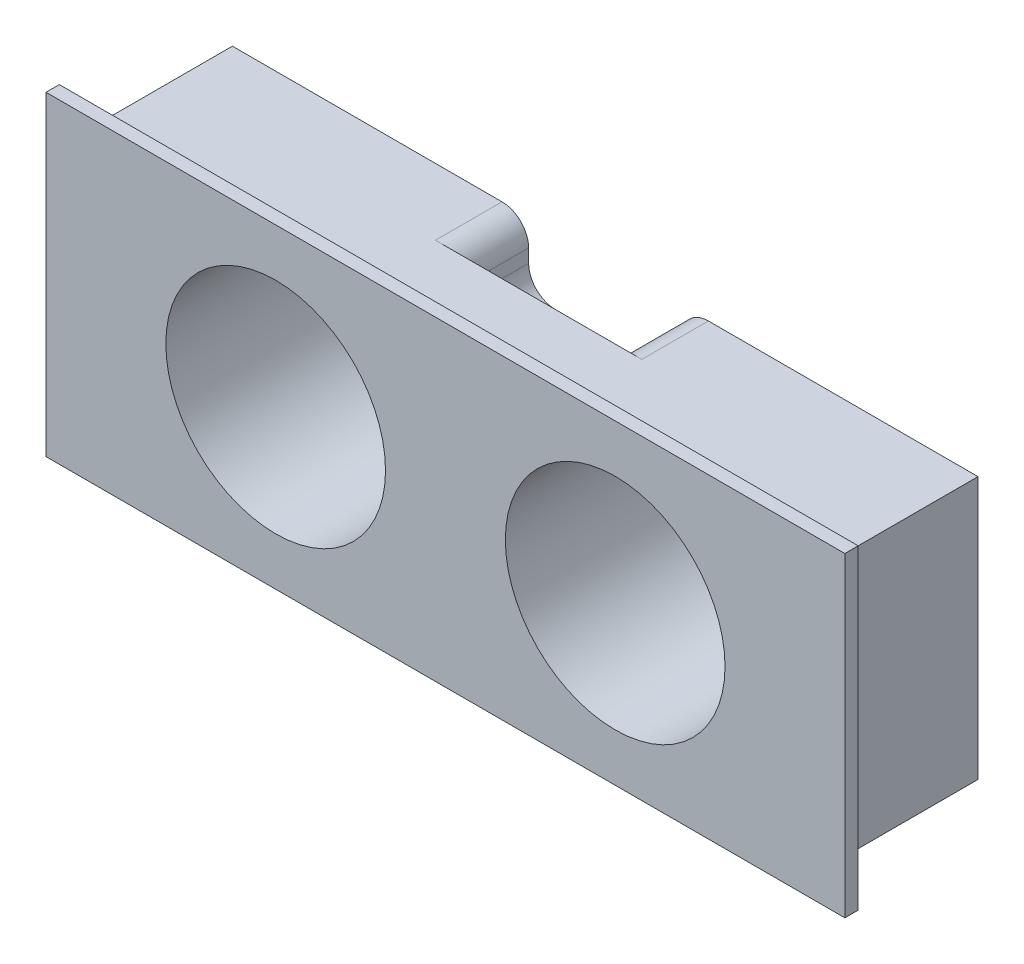
ISO-10303-21;
HEADER;
FILE_DESCRIPTION(('STEP AP214'),'2;1');
FILE_NAME('part.step','',(''),(''),'','','');
FILE_SCHEMA(('AUTOMOTIVE_DESIGN { 1 0 10303 214 1 1 1 1 }'));
ENDSEC;
DATA;
#1=APPLICATION_CONTEXT('core data for automotive mechanical design processes');
#2=APPLICATION_PROTOCOL_DEFINITION('international standard','automotive_design',2000,#1);
#3=PRODUCT_CONTEXT('',#1,'mechanical');
#4=PRODUCT('Part','Part','',(#3));
#5=PRODUCT_RELATED_PRODUCT_CATEGORY('part','',(#4));
#6=PRODUCT_DEFINITION_FORMATION('','',#4);
#7=PRODUCT_DEFINITION_CONTEXT('part definition',#1,'design');
#8=PRODUCT_DEFINITION('design','',#6,#7);
#9=PRODUCT_DEFINITION_SHAPE('','',#8);
#10=(LENGTH_UNIT() NAMED_UNIT(*) SI_UNIT(.MILLI.,.METRE.));
#11=(NAMED_UNIT(*) PLANE_ANGLE_UNIT() SI_UNIT($,.RADIAN.));
#12=(NAMED_UNIT(*) SI_UNIT($,.STERADIAN.) SOLID_ANGLE_UNIT());
#13=UNCERTAINTY_MEASURE_WITH_UNIT(LENGTH_MEASURE(1.E-05),#10,'distance_accuracy_value','');
#14=(GEOMETRIC_REPRESENTATION_CONTEXT(3) GLOBAL_UNCERTAINTY_ASSIGNED_CONTEXT((#13)) GLOBAL_UNIT_ASSIGNED_CONTEXT((#10,
#11,#12)) REPRESENTATION_CONTEXT('',''));
#15=CARTESIAN_POINT('',(0.,0.,0.));
#16=DIRECTION('',(0.,0.,1.));
#17=DIRECTION('',(1.,0.,0.));
#18=AXIS2_PLACEMENT_3D('',#15,#16,#17);
#19=CARTESIAN_POINT('',(-28.,9.85,11.));
#20=DIRECTION('',(1.,0.,0.));
#21=DIRECTION('',(0.,1.,0.));
#22=AXIS2_PLACEMENT_3D('',#19,#20,#21);
#23=PLANE('',#22);
#24=DIRECTION('',(0.,-1.,0.));
#25=VECTOR('',#24,1.);
#26=CARTESIAN_POINT('',(-28.,9.85,0.));
#27=LINE('',#26,#25);
#28=CARTESIAN_POINT('',(-28.,9.85,0.));
#29=VERTEX_POINT('',#28);
#30=CARTESIAN_POINT('',(-28.,-9.85,0.));
#31=VERTEX_POINT('',#30);
#32=EDGE_CURVE('E370',#29,#31,#27,.T.);
#33=ORIENTED_EDGE('',*,*,#32,.T.);
#34=DIRECTION('',(0.,0.,-1.));
#35=VECTOR('',#34,1.);
#36=CARTESIAN_POINT('',(-28.,-9.85,11.));
#37=LINE('',#36,#35);
#38=CARTESIAN_POINT('',(-28.,-9.85,11.));
#39=VERTEX_POINT('',#38);
#40=EDGE_CURVE('E406',#39,#31,#37,.T.);
#41=ORIENTED_EDGE('',*,*,#40,.F.);
#42=DIRECTION('',(0.,-1.,0.));
#43=VECTOR('',#42,1.);
#44=CARTESIAN_POINT('',(-28.,9.85,11.));
#45=LINE('',#44,#43);
#46=CARTESIAN_POINT('',(-28.,9.85,11.));
#47=VERTEX_POINT('',#46);
#48=EDGE_CURVE('E371',#47,#39,#45,.T.);
#49=ORIENTED_EDGE('',*,*,#48,.F.);
#50=DIRECTION('',(0.,0.,-1.));
#51=VECTOR('',#50,1.);
#52=CARTESIAN_POINT('',(-28.,9.85,11.));
#53=LINE('',#52,#51);
#54=EDGE_CURVE('E385',#47,#29,#53,.T.);
#55=ORIENTED_EDGE('',*,*,#54,.T.);
#56=EDGE_LOOP('',(#33,#41,#49,#55));
#57=FACE_BOUND('',#56,.T.);
#58=ADVANCED_FACE('F43',(#57),#23,.F.);
#59=CARTESIAN_POINT('',(-28.,-9.85,11.));
#60=DIRECTION('',(0.,1.,0.));
#61=DIRECTION('',(0.,0.,1.));
#62=AXIS2_PLACEMENT_3D('',#59,#60,#61);
#63=PLANE('',#62);
#64=DIRECTION('',(1.,0.,0.));
#65=VECTOR('',#64,1.);
#66=CARTESIAN_POINT('',(-28.,-9.85,0.));
#67=LINE('',#66,#65);
#68=CARTESIAN_POINT('',(-7.75000000000001,-9.85,0.));
#69=VERTEX_POINT('',#68);
#70=EDGE_CURVE('E389',#31,#69,#67,.T.);
#71=ORIENTED_EDGE('',*,*,#70,.T.);
#72=DIRECTION('',(0.,0.,-1.));
#73=VECTOR('',#72,1.);
#74=CARTESIAN_POINT('',(-7.75,-9.85,11.));
#75=LINE('',#74,#73);
#76=CARTESIAN_POINT('',(-7.75,-9.85,5.));
#77=VERTEX_POINT('',#76);
#78=EDGE_CURVE('E446',#69,#77,#75,.F.);
#79=ORIENTED_EDGE('',*,*,#78,.T.);
#80=DIRECTION('',(-1.,0.,0.));
#81=VECTOR('',#80,1.);
#82=CARTESIAN_POINT('',(5.75,-9.85,5.));
#83=LINE('',#82,#81);
#84=CARTESIAN_POINT('',(7.75,-9.85,5.));
#85=VERTEX_POINT('',#84);
#86=EDGE_CURVE('E65',#85,#77,#83,.T.);
#87=ORIENTED_EDGE('',*,*,#86,.F.);
#88=DIRECTION('',(0.,0.,-1.));
#89=VECTOR('',#88,1.);
#90=CARTESIAN_POINT('',(7.75,-9.85,11.));
#91=LINE('',#90,#89);
#92=CARTESIAN_POINT('',(7.74999999999999,-9.85,0.));
#93=VERTEX_POINT('',#92);
#94=EDGE_CURVE('E443',#85,#93,#91,.T.);
#95=ORIENTED_EDGE('',*,*,#94,.T.);
#96=CARTESIAN_POINT('',(28.,-9.85,0.));
#97=VERTEX_POINT('',#96);
#98=EDGE_CURVE('E388',#93,#97,#67,.T.);
#99=ORIENTED_EDGE('',*,*,#98,.T.);
#100=DIRECTION('',(0.,0.,-1.));
#101=VECTOR('',#100,1.);
#102=CARTESIAN_POINT('',(28.,-9.85,11.));
#103=LINE('',#102,#101);
#104=CARTESIAN_POINT('',(28.,-9.85,11.));
#105=VERTEX_POINT('',#104);
#106=EDGE_CURVE('E403',#105,#97,#103,.T.);
#107=ORIENTED_EDGE('',*,*,#106,.F.);
#108=DIRECTION('',(1.,0.,0.));
#109=VECTOR('',#108,1.);
#110=CARTESIAN_POINT('',(-28.,-9.85,11.));
#111=LINE('',#110,#109);
#112=EDGE_CURVE('E374',#39,#105,#111,.T.);
#113=ORIENTED_EDGE('',*,*,#112,.F.);
#114=ORIENTED_EDGE('',*,*,#40,.T.);
#115=EDGE_LOOP('',(#71,#79,#87,#95,#99,#107,#113,#114));
#116=FACE_BOUND('',#115,.T.);
#117=ADVANCED_FACE('F450',(#116),#63,.F.);
#118=CARTESIAN_POINT('',(28.,9.85,11.));
#119=DIRECTION('',(-1.,0.,0.));
#120=DIRECTION('',(0.,-1.,0.));
#121=AXIS2_PLACEMENT_3D('',#118,#119,#120);
#122=PLANE('',#121);
#123=DIRECTION('',(0.,1.,0.));
#124=VECTOR('',#123,1.);
#125=CARTESIAN_POINT('',(28.,9.85,0.));
#126=LINE('',#125,#124);
#127=CARTESIAN_POINT('',(28.,9.85,0.));
#128=VERTEX_POINT('',#127);
#129=EDGE_CURVE('E392',#97,#128,#126,.T.);
#130=ORIENTED_EDGE('',*,*,#129,.T.);
#131=DIRECTION('',(0.,0.,-1.));
#132=VECTOR('',#131,1.);
#133=CARTESIAN_POINT('',(28.,9.85,11.));
#134=LINE('',#133,#132);
#135=CARTESIAN_POINT('',(28.,9.85,11.));
#136=VERTEX_POINT('',#135);
#137=EDGE_CURVE('E400',#136,#128,#134,.T.);
#138=ORIENTED_EDGE('',*,*,#137,.F.);
#139=DIRECTION('',(0.,1.,0.));
#140=VECTOR('',#139,1.);
#141=CARTESIAN_POINT('',(28.,9.85,11.));
#142=LINE('',#141,#140);
#143=EDGE_CURVE('E378',#105,#136,#142,.T.);
#144=ORIENTED_EDGE('',*,*,#143,.F.);
#145=ORIENTED_EDGE('',*,*,#106,.T.);
#146=EDGE_LOOP('',(#130,#138,#144,#145));
#147=FACE_BOUND('',#146,.T.);
#148=ADVANCED_FACE('F481',(#147),#122,.F.);
#149=CARTESIAN_POINT('',(-28.,9.85,11.));
#150=DIRECTION('',(0.,-1.,0.));
#151=DIRECTION('',(0.,0.,-1.));
#152=AXIS2_PLACEMENT_3D('',#149,#150,#151);
#153=PLANE('',#152);
#154=DIRECTION('',(1.,0.,0.));
#155=VECTOR('',#154,1.);
#156=CARTESIAN_POINT('',(5.75,9.84999999999999,5.));
#157=LINE('',#156,#155);
#158=CARTESIAN_POINT('',(-7.75,9.84999999999999,5.));
#159=VERTEX_POINT('',#158);
#160=CARTESIAN_POINT('',(7.75,9.84999999999999,5.));
#161=VERTEX_POINT('',#160);
#162=EDGE_CURVE('E290',#159,#161,#157,.T.);
#163=ORIENTED_EDGE('',*,*,#162,.F.);
#164=DIRECTION('',(0.,0.,-1.));
#165=VECTOR('',#164,1.);
#166=CARTESIAN_POINT('',(-7.75,9.85,11.));
#167=LINE('',#166,#165);
#168=CARTESIAN_POINT('',(-7.75,9.85,0.));
#169=VERTEX_POINT('',#168);
#170=EDGE_CURVE('E413',#159,#169,#167,.T.);
#171=ORIENTED_EDGE('',*,*,#170,.T.);
#172=DIRECTION('',(-1.,0.,0.));
#173=VECTOR('',#172,1.);
#174=CARTESIAN_POINT('',(-28.,9.85,0.));
#175=LINE('',#174,#173);
#176=EDGE_CURVE('E394',#169,#29,#175,.T.);
#177=ORIENTED_EDGE('',*,*,#176,.T.);
#178=ORIENTED_EDGE('',*,*,#54,.F.);
#179=DIRECTION('',(-1.,0.,0.));
#180=VECTOR('',#179,1.);
#181=CARTESIAN_POINT('',(-28.,9.85,11.));
#182=LINE('',#181,#180);
#183=EDGE_CURVE('E381',#136,#47,#182,.T.);
#184=ORIENTED_EDGE('',*,*,#183,.F.);
#185=ORIENTED_EDGE('',*,*,#137,.T.);
#186=CARTESIAN_POINT('',(7.75,9.85,0.));
#187=VERTEX_POINT('',#186);
#188=EDGE_CURVE('E375',#128,#187,#175,.T.);
#189=ORIENTED_EDGE('',*,*,#188,.T.);
#190=DIRECTION('',(0.,0.,-1.));
#191=VECTOR('',#190,1.);
#192=CARTESIAN_POINT('',(7.75,9.85,11.));
#193=LINE('',#192,#191);
#194=EDGE_CURVE('E409',#187,#161,#193,.F.);
#195=ORIENTED_EDGE('',*,*,#194,.T.);
#196=EDGE_LOOP('',(#163,#171,#177,#178,#184,#185,#189,#195));
#197=FACE_BOUND('',#196,.T.);
#198=ADVANCED_FACE('F564',(#197),#153,.F.);
#199=CARTESIAN_POINT('',(0.,0.,0.));
#200=DIRECTION('',(0.,0.,1.));
#201=DIRECTION('',(1.,0.,0.));
#202=AXIS2_PLACEMENT_3D('',#199,#200,#201);
#203=PLANE('',#202);
#204=CARTESIAN_POINT('',(12.75,0.,0.));
#205=DIRECTION('',(0.,0.,1.));
#206=DIRECTION('',(1.,0.,0.));
#207=AXIS2_PLACEMENT_3D('',#204,#205,#206);
#208=CIRCLE('',#207,8.25);
#209=CARTESIAN_POINT('',(21.,0.,0.));
#210=VERTEX_POINT('',#209);
#211=EDGE_CURVE('E324',#210,#210,#208,.T.);
#212=ORIENTED_EDGE('',*,*,#211,.T.);
#213=EDGE_LOOP('',(#212));
#214=FACE_BOUND('',#213,.T.);
#215=CARTESIAN_POINT('',(-12.75,0.,0.));
#216=DIRECTION('',(0.,0.,1.));
#217=DIRECTION('',(1.,0.,0.));
#218=AXIS2_PLACEMENT_3D('',#215,#216,#217);
#219=CIRCLE('',#218,8.25);
#220=CARTESIAN_POINT('',(-4.5,0.,0.));
#221=VERTEX_POINT('',#220);
#222=EDGE_CURVE('E331',#221,#221,#219,.T.);
#223=ORIENTED_EDGE('',*,*,#222,.T.);
#224=EDGE_LOOP('',(#223));
#225=FACE_BOUND('',#224,.T.);
#226=DIRECTION('',(0.,1.,0.));
#227=VECTOR('',#226,1.);
#228=CARTESIAN_POINT('',(-5.75,-6.85,0.));
#229=LINE('',#228,#227);
#230=CARTESIAN_POINT('',(-5.75,-7.85,0.));
#231=VERTEX_POINT('',#230);
#232=CARTESIAN_POINT('',(-5.75,-6.85,0.));
#233=VERTEX_POINT('',#232);
#234=EDGE_CURVE('E236',#231,#233,#229,.T.);
#235=ORIENTED_EDGE('',*,*,#234,.F.);
#236=CARTESIAN_POINT('',(-7.75,-7.85,0.));
#237=DIRECTION('',(0.,0.,1.));
#238=DIRECTION('',(1.,0.,0.));
#239=AXIS2_PLACEMENT_3D('',#236,#237,#238);
#240=CIRCLE('',#239,2.);
#241=EDGE_CURVE('E441',#231,#69,#240,.F.);
#242=ORIENTED_EDGE('',*,*,#241,.T.);
#243=ORIENTED_EDGE('',*,*,#70,.F.);
#244=ORIENTED_EDGE('',*,*,#32,.F.);
#245=ORIENTED_EDGE('',*,*,#176,.F.);
#246=CARTESIAN_POINT('',(-7.75,7.85,0.));
#247=DIRECTION('',(0.,0.,1.));
#248=DIRECTION('',(1.,0.,0.));
#249=AXIS2_PLACEMENT_3D('',#246,#247,#248);
#250=CIRCLE('',#249,2.);
#251=CARTESIAN_POINT('',(-5.75,7.85,0.));
#252=VERTEX_POINT('',#251);
#253=EDGE_CURVE('E420',#169,#252,#250,.F.);
#254=ORIENTED_EDGE('',*,*,#253,.T.);
#255=DIRECTION('',(0.,1.,0.));
#256=VECTOR('',#255,1.);
#257=CARTESIAN_POINT('',(-5.75,9.84999999999999,0.));
#258=LINE('',#257,#256);
#259=CARTESIAN_POINT('',(-5.75,6.84999999999999,0.));
#260=VERTEX_POINT('',#259);
#261=EDGE_CURVE('E274',#260,#252,#258,.T.);
#262=ORIENTED_EDGE('',*,*,#261,.F.);
#263=CARTESIAN_POINT('',(-3.75,6.84999999999999,0.));
#264=DIRECTION('',(0.,0.,-1.));
#265=DIRECTION('',(-1.,0.,0.));
#266=AXIS2_PLACEMENT_3D('',#263,#264,#265);
#267=CIRCLE('',#266,2.);
#268=CARTESIAN_POINT('',(-3.75,4.84999999999999,0.));
#269=VERTEX_POINT('',#268);
#270=EDGE_CURVE('E304',#269,#260,#267,.T.);
#271=ORIENTED_EDGE('',*,*,#270,.F.);
#272=DIRECTION('',(-1.,0.,0.));
#273=VECTOR('',#272,1.);
#274=CARTESIAN_POINT('',(3.75,4.84999999999999,0.));
#275=LINE('',#274,#273);
#276=CARTESIAN_POINT('',(3.75,4.84999999999999,0.));
#277=VERTEX_POINT('',#276);
#278=EDGE_CURVE('E300',#277,#269,#275,.T.);
#279=ORIENTED_EDGE('',*,*,#278,.F.);
#280=CARTESIAN_POINT('',(3.75,6.84999999999999,0.));
#281=DIRECTION('',(0.,0.,-1.));
#282=DIRECTION('',(-1.,0.,0.));
#283=AXIS2_PLACEMENT_3D('',#280,#281,#282);
#284=CIRCLE('',#283,2.);
#285=CARTESIAN_POINT('',(5.75,6.84999999999999,0.));
#286=VERTEX_POINT('',#285);
#287=EDGE_CURVE('E296',#286,#277,#284,.T.);
#288=ORIENTED_EDGE('',*,*,#287,.F.);
#289=DIRECTION('',(0.,-1.,0.));
#290=VECTOR('',#289,1.);
#291=CARTESIAN_POINT('',(5.75,9.84999999999999,0.));
#292=LINE('',#291,#290);
#293=CARTESIAN_POINT('',(5.75,7.85,0.));
#294=VERTEX_POINT('',#293);
#295=EDGE_CURVE('E266',#294,#286,#292,.T.);
#296=ORIENTED_EDGE('',*,*,#295,.F.);
#297=CARTESIAN_POINT('',(7.75,7.85,0.));
#298=DIRECTION('',(0.,0.,1.));
#299=DIRECTION('',(1.,0.,0.));
#300=AXIS2_PLACEMENT_3D('',#297,#298,#299);
#301=CIRCLE('',#300,2.);
#302=EDGE_CURVE('E417',#294,#187,#301,.F.);
#303=ORIENTED_EDGE('',*,*,#302,.T.);
#304=ORIENTED_EDGE('',*,*,#188,.F.);
#305=ORIENTED_EDGE('',*,*,#129,.F.);
#306=ORIENTED_EDGE('',*,*,#98,.F.);
#307=CARTESIAN_POINT('',(7.75,-7.85,0.));
#308=DIRECTION('',(0.,0.,1.));
#309=DIRECTION('',(1.,0.,0.));
#310=AXIS2_PLACEMENT_3D('',#307,#308,#309);
#311=CIRCLE('',#310,2.);
#312=CARTESIAN_POINT('',(5.75,-7.85,0.));
#313=VERTEX_POINT('',#312);
#314=EDGE_CURVE('E439',#93,#313,#311,.F.);
#315=ORIENTED_EDGE('',*,*,#314,.T.);
#316=DIRECTION('',(0.,-1.,0.));
#317=VECTOR('',#316,1.);
#318=CARTESIAN_POINT('',(5.75,-6.85,0.));
#319=LINE('',#318,#317);
#320=CARTESIAN_POINT('',(5.75,-6.85,0.));
#321=VERTEX_POINT('',#320);
#322=EDGE_CURVE('E230',#321,#313,#319,.T.);
#323=ORIENTED_EDGE('',*,*,#322,.F.);
#324=CARTESIAN_POINT('',(3.75,-6.85,0.));
#325=DIRECTION('',(0.,0.,-1.));
#326=DIRECTION('',(-1.,0.,0.));
#327=AXIS2_PLACEMENT_3D('',#324,#325,#326);
#328=CIRCLE('',#327,2.);
#329=CARTESIAN_POINT('',(3.75,-4.85,0.));
#330=VERTEX_POINT('',#329);
#331=EDGE_CURVE('E260',#330,#321,#328,.T.);
#332=ORIENTED_EDGE('',*,*,#331,.F.);
#333=DIRECTION('',(1.,0.,0.));
#334=VECTOR('',#333,1.);
#335=CARTESIAN_POINT('',(3.75,-4.85,0.));
#336=LINE('',#335,#334);
#337=CARTESIAN_POINT('',(-3.75,-4.85,0.));
#338=VERTEX_POINT('',#337);
#339=EDGE_CURVE('E257',#338,#330,#336,.T.);
#340=ORIENTED_EDGE('',*,*,#339,.F.);
#341=CARTESIAN_POINT('',(-3.75,-6.85,0.));
#342=DIRECTION('',(0.,0.,-1.));
#343=DIRECTION('',(1.,0.,0.));
#344=AXIS2_PLACEMENT_3D('',#341,#342,#343);
#345=CIRCLE('',#344,2.);
#346=EDGE_CURVE('E255',#233,#338,#345,.T.);
#347=ORIENTED_EDGE('',*,*,#346,.F.);
#348=EDGE_LOOP('',(#235,#242,#243,#244,#245,#254,#262,#271,#279,#288,#296,#303,#304,#305,#306,
#315,#323,#332,#340,#347));
#349=FACE_BOUND('',#348,.T.);
#350=ADVANCED_FACE('F454',(#214,#225,#349),#203,.F.);
#351=CARTESIAN_POINT('',(0.,0.,11.));
#352=DIRECTION('',(0.,0.,1.));
#353=DIRECTION('',(1.,0.,0.));
#354=AXIS2_PLACEMENT_3D('',#351,#352,#353);
#355=PLANE('',#354);
#356=DIRECTION('',(0.,-1.,0.));
#357=VECTOR('',#356,1.);
#358=CARTESIAN_POINT('',(-30.,11.85,11.));
#359=LINE('',#358,#357);
#360=CARTESIAN_POINT('',(-30.,11.85,11.));
#361=VERTEX_POINT('',#360);
#362=CARTESIAN_POINT('',(-30.,-11.85,11.));
#363=VERTEX_POINT('',#362);
#364=EDGE_CURVE('E335',#361,#363,#359,.T.);
#365=ORIENTED_EDGE('',*,*,#364,.F.);
#366=DIRECTION('',(-1.,0.,0.));
#367=VECTOR('',#366,1.);
#368=CARTESIAN_POINT('',(-30.,11.85,11.));
#369=LINE('',#368,#367);
#370=CARTESIAN_POINT('',(30.,11.85,11.));
#371=VERTEX_POINT('',#370);
#372=EDGE_CURVE('E343',#371,#361,#369,.T.);
#373=ORIENTED_EDGE('',*,*,#372,.F.);
#374=DIRECTION('',(0.,1.,0.));
#375=VECTOR('',#374,1.);
#376=CARTESIAN_POINT('',(30.,11.85,11.));
#377=LINE('',#376,#375);
#378=CARTESIAN_POINT('',(30.,-11.85,11.));
#379=VERTEX_POINT('',#378);
#380=EDGE_CURVE('E355',#379,#371,#377,.T.);
#381=ORIENTED_EDGE('',*,*,#380,.F.);
#382=DIRECTION('',(1.,0.,0.));
#383=VECTOR('',#382,1.);
#384=CARTESIAN_POINT('',(-30.,-11.85,11.));
#385=LINE('',#384,#383);
#386=EDGE_CURVE('E353',#363,#379,#385,.T.);
#387=ORIENTED_EDGE('',*,*,#386,.F.);
#388=EDGE_LOOP('',(#365,#373,#381,#387));
#389=FACE_BOUND('',#388,.T.);
#390=ORIENTED_EDGE('',*,*,#183,.T.);
#391=ORIENTED_EDGE('',*,*,#48,.T.);
#392=ORIENTED_EDGE('',*,*,#112,.T.);
#393=ORIENTED_EDGE('',*,*,#143,.T.);
#394=EDGE_LOOP('',(#390,#391,#392,#393));
#395=FACE_BOUND('',#394,.T.);
#396=ADVANCED_FACE('F543',(#389,#395),#355,.F.);
#397=CARTESIAN_POINT('',(-30.,11.85,12.));
#398=DIRECTION('',(1.,0.,0.));
#399=DIRECTION('',(0.,1.,0.));
#400=AXIS2_PLACEMENT_3D('',#397,#398,#399);
#401=PLANE('',#400);
#402=ORIENTED_EDGE('',*,*,#364,.T.);
#403=DIRECTION('',(0.,0.,-1.));
#404=VECTOR('',#403,1.);
#405=CARTESIAN_POINT('',(-30.,-11.85,12.));
#406=LINE('',#405,#404);
#407=CARTESIAN_POINT('',(-30.,-11.85,12.));
#408=VERTEX_POINT('',#407);
#409=EDGE_CURVE('E367',#408,#363,#406,.T.);
#410=ORIENTED_EDGE('',*,*,#409,.F.);
#411=DIRECTION('',(0.,-1.,0.));
#412=VECTOR('',#411,1.);
#413=CARTESIAN_POINT('',(-30.,11.85,12.));
#414=LINE('',#413,#412);
#415=CARTESIAN_POINT('',(-30.,11.85,12.));
#416=VERTEX_POINT('',#415);
#417=EDGE_CURVE('E339',#416,#408,#414,.T.);
#418=ORIENTED_EDGE('',*,*,#417,.F.);
#419=DIRECTION('',(0.,0.,-1.));
#420=VECTOR('',#419,1.);
#421=CARTESIAN_POINT('',(-30.,11.85,12.));
#422=LINE('',#421,#420);
#423=EDGE_CURVE('E350',#416,#361,#422,.T.);
#424=ORIENTED_EDGE('',*,*,#423,.T.);
#425=EDGE_LOOP('',(#402,#410,#418,#424));
#426=FACE_BOUND('',#425,.T.);
#427=ADVANCED_FACE('F546',(#426),#401,.F.);
#428=CARTESIAN_POINT('',(-30.,-11.85,12.));
#429=DIRECTION('',(0.,1.,0.));
#430=DIRECTION('',(-1.,0.,0.));
#431=AXIS2_PLACEMENT_3D('',#428,#429,#430);
#432=PLANE('',#431);
#433=ORIENTED_EDGE('',*,*,#386,.T.);
#434=DIRECTION('',(0.,0.,-1.));
#435=VECTOR('',#434,1.);
#436=CARTESIAN_POINT('',(30.,-11.85,12.));
#437=LINE('',#436,#435);
#438=CARTESIAN_POINT('',(30.,-11.85,12.));
#439=VERTEX_POINT('',#438);
#440=EDGE_CURVE('E364',#439,#379,#437,.T.);
#441=ORIENTED_EDGE('',*,*,#440,.F.);
#442=DIRECTION('',(1.,0.,0.));
#443=VECTOR('',#442,1.);
#444=CARTESIAN_POINT('',(-30.,-11.85,12.));
#445=LINE('',#444,#443);
#446=EDGE_CURVE('E342',#408,#439,#445,.T.);
#447=ORIENTED_EDGE('',*,*,#446,.F.);
#448=ORIENTED_EDGE('',*,*,#409,.T.);
#449=EDGE_LOOP('',(#433,#441,#447,#448));
#450=FACE_BOUND('',#449,.T.);
#451=ADVANCED_FACE('F554',(#450),#432,.F.);
#452=CARTESIAN_POINT('',(30.,11.85,12.));
#453=DIRECTION('',(-1.,0.,0.));
#454=DIRECTION('',(0.,-1.,0.));
#455=AXIS2_PLACEMENT_3D('',#452,#453,#454);
#456=PLANE('',#455);
#457=ORIENTED_EDGE('',*,*,#380,.T.);
#458=DIRECTION('',(0.,0.,-1.));
#459=VECTOR('',#458,1.);
#460=CARTESIAN_POINT('',(30.,11.85,12.));
#461=LINE('',#460,#459);
#462=CARTESIAN_POINT('',(30.,11.85,12.));
#463=VERTEX_POINT('',#462);
#464=EDGE_CURVE('E361',#463,#371,#461,.T.);
#465=ORIENTED_EDGE('',*,*,#464,.F.);
#466=DIRECTION('',(0.,1.,0.));
#467=VECTOR('',#466,1.);
#468=CARTESIAN_POINT('',(30.,11.85,12.));
#469=LINE('',#468,#467);
#470=EDGE_CURVE('E345',#439,#463,#469,.T.);
#471=ORIENTED_EDGE('',*,*,#470,.F.);
#472=ORIENTED_EDGE('',*,*,#440,.T.);
#473=EDGE_LOOP('',(#457,#465,#471,#472));
#474=FACE_BOUND('',#473,.T.);
#475=ADVANCED_FACE('F550',(#474),#456,.F.);
#476=CARTESIAN_POINT('',(-30.,11.85,12.));
#477=DIRECTION('',(0.,-1.,0.));
#478=DIRECTION('',(0.,0.,-1.));
#479=AXIS2_PLACEMENT_3D('',#476,#477,#478);
#480=PLANE('',#479);
#481=ORIENTED_EDGE('',*,*,#372,.T.);
#482=ORIENTED_EDGE('',*,*,#423,.F.);
#483=DIRECTION('',(-1.,0.,0.));
#484=VECTOR('',#483,1.);
#485=CARTESIAN_POINT('',(-30.,11.85,12.));
#486=LINE('',#485,#484);
#487=EDGE_CURVE('E347',#463,#416,#486,.T.);
#488=ORIENTED_EDGE('',*,*,#487,.F.);
#489=ORIENTED_EDGE('',*,*,#464,.T.);
#490=EDGE_LOOP('',(#481,#482,#488,#489));
#491=FACE_BOUND('',#490,.T.);
#492=ADVANCED_FACE('F541',(#491),#480,.F.);
#493=CARTESIAN_POINT('',(0.,0.,12.));
#494=DIRECTION('',(0.,0.,1.));
#495=DIRECTION('',(1.,0.,0.));
#496=AXIS2_PLACEMENT_3D('',#493,#494,#495);
#497=PLANE('',#496);
#498=CARTESIAN_POINT('',(12.75,0.,12.));
#499=DIRECTION('',(0.,0.,1.));
#500=DIRECTION('',(1.,0.,0.));
#501=AXIS2_PLACEMENT_3D('',#498,#499,#500);
#502=CIRCLE('',#501,8.25);
#503=CARTESIAN_POINT('',(21.,0.,12.));
#504=VERTEX_POINT('',#503);
#505=EDGE_CURVE('E314',#504,#504,#502,.T.);
#506=ORIENTED_EDGE('',*,*,#505,.F.);
#507=EDGE_LOOP('',(#506));
#508=FACE_BOUND('',#507,.T.);
#509=CARTESIAN_POINT('',(-12.75,0.,12.));
#510=DIRECTION('',(0.,0.,1.));
#511=DIRECTION('',(1.,0.,0.));
#512=AXIS2_PLACEMENT_3D('',#509,#510,#511);
#513=CIRCLE('',#512,8.25);
#514=CARTESIAN_POINT('',(-4.5,0.,12.));
#515=VERTEX_POINT('',#514);
#516=EDGE_CURVE('E328',#515,#515,#513,.T.);
#517=ORIENTED_EDGE('',*,*,#516,.F.);
#518=EDGE_LOOP('',(#517));
#519=FACE_BOUND('',#518,.T.);
#520=ORIENTED_EDGE('',*,*,#417,.T.);
#521=ORIENTED_EDGE('',*,*,#446,.T.);
#522=ORIENTED_EDGE('',*,*,#470,.T.);
#523=ORIENTED_EDGE('',*,*,#487,.T.);
#524=EDGE_LOOP('',(#520,#521,#522,#523));
#525=FACE_BOUND('',#524,.T.);
#526=ADVANCED_FACE('F537',(#508,#519,#525),#497,.T.);
#527=CARTESIAN_POINT('',(-12.75,0.,0.));
#528=DIRECTION('',(0.,0.,1.));
#529=DIRECTION('',(1.,0.,0.));
#530=AXIS2_PLACEMENT_3D('',#527,#528,#529);
#531=CYLINDRICAL_SURFACE('',#530,8.25);
#532=ORIENTED_EDGE('',*,*,#222,.F.);
#533=EDGE_LOOP('',(#532));
#534=FACE_BOUND('',#533,.T.);
#535=ORIENTED_EDGE('',*,*,#516,.T.);
#536=EDGE_LOOP('',(#535));
#537=FACE_BOUND('',#536,.T.);
#538=ADVANCED_FACE('F533',(#534,#537),#531,.F.);
#539=CARTESIAN_POINT('',(12.75,0.,0.));
#540=DIRECTION('',(0.,0.,1.));
#541=DIRECTION('',(1.,0.,0.));
#542=AXIS2_PLACEMENT_3D('',#539,#540,#541);
#543=CYLINDRICAL_SURFACE('',#542,8.25);
#544=ORIENTED_EDGE('',*,*,#211,.F.);
#545=EDGE_LOOP('',(#544));
#546=FACE_BOUND('',#545,.T.);
#547=ORIENTED_EDGE('',*,*,#505,.T.);
#548=EDGE_LOOP('',(#547));
#549=FACE_BOUND('',#548,.T.);
#550=ADVANCED_FACE('F529',(#546,#549),#543,.F.);
#551=CARTESIAN_POINT('',(5.75,9.84999999999999,5.));
#552=DIRECTION('',(1.,0.,0.));
#553=DIRECTION('',(0.,1.,0.));
#554=AXIS2_PLACEMENT_3D('',#551,#552,#553);
#555=PLANE('',#554);
#556=DIRECTION('',(0.,-1.,0.));
#557=VECTOR('',#556,1.);
#558=CARTESIAN_POINT('',(5.75,9.84999999999999,5.));
#559=LINE('',#558,#557);
#560=CARTESIAN_POINT('',(5.75,7.85,5.));
#561=VERTEX_POINT('',#560);
#562=CARTESIAN_POINT('',(5.75,6.84999999999999,5.));
#563=VERTEX_POINT('',#562);
#564=EDGE_CURVE('E270',#561,#563,#559,.T.);
#565=ORIENTED_EDGE('',*,*,#564,.F.);
#566=DIRECTION('',(0.,0.,-1.));
#567=VECTOR('',#566,1.);
#568=CARTESIAN_POINT('',(5.75,7.85,5.));
#569=LINE('',#568,#567);
#570=EDGE_CURVE('E426',#561,#294,#569,.T.);
#571=ORIENTED_EDGE('',*,*,#570,.T.);
#572=ORIENTED_EDGE('',*,*,#295,.T.);
#573=DIRECTION('',(0.,0.,-1.));
#574=VECTOR('',#573,1.);
#575=CARTESIAN_POINT('',(5.75,6.84999999999999,5.));
#576=LINE('',#575,#574);
#577=EDGE_CURVE('E293',#563,#286,#576,.T.);
#578=ORIENTED_EDGE('',*,*,#577,.F.);
#579=EDGE_LOOP('',(#565,#571,#572,#578));
#580=FACE_BOUND('',#579,.T.);
#581=ADVANCED_FACE('F515',(#580),#555,.F.);
#582=CARTESIAN_POINT('',(-5.75,9.84999999999999,5.));
#583=DIRECTION('',(-1.,0.,0.));
#584=DIRECTION('',(0.,-1.,0.));
#585=AXIS2_PLACEMENT_3D('',#582,#583,#584);
#586=PLANE('',#585);
#587=ORIENTED_EDGE('',*,*,#261,.T.);
#588=DIRECTION('',(0.,0.,-1.));
#589=VECTOR('',#588,1.);
#590=CARTESIAN_POINT('',(-5.75,7.85,5.));
#591=LINE('',#590,#589);
#592=CARTESIAN_POINT('',(-5.75,7.85,5.));
#593=VERTEX_POINT('',#592);
#594=EDGE_CURVE('E423',#252,#593,#591,.F.);
#595=ORIENTED_EDGE('',*,*,#594,.T.);
#596=DIRECTION('',(0.,1.,0.));
#597=VECTOR('',#596,1.);
#598=CARTESIAN_POINT('',(-5.75,9.84999999999999,5.));
#599=LINE('',#598,#597);
#600=CARTESIAN_POINT('',(-5.75,6.84999999999999,5.));
#601=VERTEX_POINT('',#600);
#602=EDGE_CURVE('E286',#601,#593,#599,.T.);
#603=ORIENTED_EDGE('',*,*,#602,.F.);
#604=DIRECTION('',(0.,0.,-1.));
#605=VECTOR('',#604,1.);
#606=CARTESIAN_POINT('',(-5.75,6.84999999999999,5.));
#607=LINE('',#606,#605);
#608=EDGE_CURVE('E311',#601,#260,#607,.T.);
#609=ORIENTED_EDGE('',*,*,#608,.T.);
#610=EDGE_LOOP('',(#587,#595,#603,#609));
#611=FACE_BOUND('',#610,.T.);
#612=ADVANCED_FACE('F511',(#611),#586,.F.);
#613=CARTESIAN_POINT('',(-3.75,6.84999999999999,5.));
#614=DIRECTION('',(0.,0.,-1.));
#615=DIRECTION('',(-1.,0.,0.));
#616=AXIS2_PLACEMENT_3D('',#613,#614,#615);
#617=CYLINDRICAL_SURFACE('',#616,2.);
#618=ORIENTED_EDGE('',*,*,#270,.T.);
#619=ORIENTED_EDGE('',*,*,#608,.F.);
#620=CARTESIAN_POINT('',(-3.75,6.84999999999999,5.));
#621=DIRECTION('',(0.,0.,-1.));
#622=DIRECTION('',(-1.,0.,0.));
#623=AXIS2_PLACEMENT_3D('',#620,#621,#622);
#624=CIRCLE('',#623,2.);
#625=CARTESIAN_POINT('',(-3.75,4.84999999999999,5.));
#626=VERTEX_POINT('',#625);
#627=EDGE_CURVE('E282',#626,#601,#624,.T.);
#628=ORIENTED_EDGE('',*,*,#627,.F.);
#629=DIRECTION('',(0.,0.,-1.));
#630=VECTOR('',#629,1.);
#631=CARTESIAN_POINT('',(-3.75,4.84999999999999,5.));
#632=LINE('',#631,#630);
#633=EDGE_CURVE('E315',#626,#269,#632,.T.);
#634=ORIENTED_EDGE('',*,*,#633,.T.);
#635=EDGE_LOOP('',(#618,#619,#628,#634));
#636=FACE_BOUND('',#635,.T.);
#637=ADVANCED_FACE('F514',(#636),#617,.F.);
#638=CARTESIAN_POINT('',(3.75,4.84999999999999,5.));
#639=DIRECTION('',(0.,-1.,0.));
#640=DIRECTION('',(0.,0.,-1.));
#641=AXIS2_PLACEMENT_3D('',#638,#639,#640);
#642=PLANE('',#641);
#643=ORIENTED_EDGE('',*,*,#278,.T.);
#644=ORIENTED_EDGE('',*,*,#633,.F.);
#645=DIRECTION('',(-1.,0.,0.));
#646=VECTOR('',#645,1.);
#647=CARTESIAN_POINT('',(3.75,4.84999999999999,5.));
#648=LINE('',#647,#646);
#649=CARTESIAN_POINT('',(3.75,4.84999999999999,5.));
#650=VERTEX_POINT('',#649);
#651=EDGE_CURVE('E278',#650,#626,#648,.T.);
#652=ORIENTED_EDGE('',*,*,#651,.F.);
#653=DIRECTION('',(0.,0.,-1.));
#654=VECTOR('',#653,1.);
#655=CARTESIAN_POINT('',(3.75,4.84999999999999,5.));
#656=LINE('',#655,#654);
#657=EDGE_CURVE('E318',#650,#277,#656,.T.);
#658=ORIENTED_EDGE('',*,*,#657,.T.);
#659=EDGE_LOOP('',(#643,#644,#652,#658));
#660=FACE_BOUND('',#659,.T.);
#661=ADVANCED_FACE('F519',(#660),#642,.F.);
#662=CARTESIAN_POINT('',(3.75,6.84999999999999,5.));
#663=DIRECTION('',(0.,0.,-1.));
#664=DIRECTION('',(-1.,0.,0.));
#665=AXIS2_PLACEMENT_3D('',#662,#663,#664);
#666=CYLINDRICAL_SURFACE('',#665,2.);
#667=ORIENTED_EDGE('',*,*,#287,.T.);
#668=ORIENTED_EDGE('',*,*,#657,.F.);
#669=CARTESIAN_POINT('',(3.75,6.84999999999999,5.));
#670=DIRECTION('',(0.,0.,-1.));
#671=DIRECTION('',(-1.,0.,0.));
#672=AXIS2_PLACEMENT_3D('',#669,#670,#671);
#673=CIRCLE('',#672,2.);
#674=EDGE_CURVE('E273',#563,#650,#673,.T.);
#675=ORIENTED_EDGE('',*,*,#674,.F.);
#676=ORIENTED_EDGE('',*,*,#577,.T.);
#677=EDGE_LOOP('',(#667,#668,#675,#676));
#678=FACE_BOUND('',#677,.T.);
#679=ADVANCED_FACE('F509',(#678),#666,.F.);
#680=CARTESIAN_POINT('',(3.75,6.84999999999999,5.));
#681=DIRECTION('',(0.,0.,-1.));
#682=DIRECTION('',(-1.,0.,0.));
#683=AXIS2_PLACEMENT_3D('',#680,#681,#682);
#684=PLANE('',#683);
#685=ORIENTED_EDGE('',*,*,#162,.T.);
#686=CARTESIAN_POINT('',(7.75,7.85,5.));
#687=DIRECTION('',(0.,0.,-1.));
#688=DIRECTION('',(-1.,0.,0.));
#689=AXIS2_PLACEMENT_3D('',#686,#687,#688);
#690=CIRCLE('',#689,2.);
#691=EDGE_CURVE('E434',#161,#561,#690,.F.);
#692=ORIENTED_EDGE('',*,*,#691,.T.);
#693=ORIENTED_EDGE('',*,*,#564,.T.);
#694=ORIENTED_EDGE('',*,*,#674,.T.);
#695=ORIENTED_EDGE('',*,*,#651,.T.);
#696=ORIENTED_EDGE('',*,*,#627,.T.);
#697=ORIENTED_EDGE('',*,*,#602,.T.);
#698=CARTESIAN_POINT('',(-7.75,7.85,5.));
#699=DIRECTION('',(0.,0.,-1.));
#700=DIRECTION('',(-1.,0.,0.));
#701=AXIS2_PLACEMENT_3D('',#698,#699,#700);
#702=CIRCLE('',#701,2.);
#703=EDGE_CURVE('E430',#593,#159,#702,.F.);
#704=ORIENTED_EDGE('',*,*,#703,.T.);
#705=EDGE_LOOP('',(#685,#692,#693,#694,#695,#696,#697,#704));
#706=FACE_BOUND('',#705,.T.);
#707=ADVANCED_FACE('F488',(#706),#684,.T.);
#708=CARTESIAN_POINT('',(-7.75,7.85,11.));
#709=DIRECTION('',(0.,0.,-1.));
#710=DIRECTION('',(-1.,0.,0.));
#711=AXIS2_PLACEMENT_3D('',#708,#709,#710);
#712=CYLINDRICAL_SURFACE('',#711,2.);
#713=ORIENTED_EDGE('',*,*,#703,.F.);
#714=ORIENTED_EDGE('',*,*,#594,.F.);
#715=ORIENTED_EDGE('',*,*,#253,.F.);
#716=ORIENTED_EDGE('',*,*,#170,.F.);
#717=EDGE_LOOP('',(#713,#714,#715,#716));
#718=FACE_BOUND('',#717,.T.);
#719=ADVANCED_FACE('F485',(#718),#712,.T.);
#720=CARTESIAN_POINT('',(7.75,7.85,5.));
#721=DIRECTION('',(0.,0.,-1.));
#722=DIRECTION('',(-1.,0.,0.));
#723=AXIS2_PLACEMENT_3D('',#720,#721,#722);
#724=CYLINDRICAL_SURFACE('',#723,2.);
#725=ORIENTED_EDGE('',*,*,#691,.F.);
#726=ORIENTED_EDGE('',*,*,#194,.F.);
#727=ORIENTED_EDGE('',*,*,#302,.F.);
#728=ORIENTED_EDGE('',*,*,#570,.F.);
#729=EDGE_LOOP('',(#725,#726,#727,#728));
#730=FACE_BOUND('',#729,.T.);
#731=ADVANCED_FACE('F472',(#730),#724,.T.);
#732=CARTESIAN_POINT('',(-5.75,-6.85,5.));
#733=DIRECTION('',(-1.,0.,0.));
#734=DIRECTION('',(0.,-1.,0.));
#735=AXIS2_PLACEMENT_3D('',#732,#733,#734);
#736=PLANE('',#735);
#737=DIRECTION('',(0.,1.,0.));
#738=VECTOR('',#737,1.);
#739=CARTESIAN_POINT('',(-5.75,-6.85,5.));
#740=LINE('',#739,#738);
#741=CARTESIAN_POINT('',(-5.75,-7.85,5.));
#742=VERTEX_POINT('',#741);
#743=CARTESIAN_POINT('',(-5.75,-6.85,5.));
#744=VERTEX_POINT('',#743);
#745=EDGE_CURVE('E220',#742,#744,#740,.T.);
#746=ORIENTED_EDGE('',*,*,#745,.F.);
#747=DIRECTION('',(0.,0.,-1.));
#748=VECTOR('',#747,1.);
#749=CARTESIAN_POINT('',(-5.75,-7.85,5.));
#750=LINE('',#749,#748);
#751=EDGE_CURVE('E437',#742,#231,#750,.T.);
#752=ORIENTED_EDGE('',*,*,#751,.T.);
#753=ORIENTED_EDGE('',*,*,#234,.T.);
#754=DIRECTION('',(0.,0.,-1.));
#755=VECTOR('',#754,1.);
#756=CARTESIAN_POINT('',(-5.75,-6.85,5.));
#757=LINE('',#756,#755);
#758=EDGE_CURVE('E233',#744,#233,#757,.T.);
#759=ORIENTED_EDGE('',*,*,#758,.F.);
#760=EDGE_LOOP('',(#746,#752,#753,#759));
#761=FACE_BOUND('',#760,.T.);
#762=ADVANCED_FACE('F234',(#761),#736,.F.);
#763=CARTESIAN_POINT('',(5.75,-6.85,5.));
#764=DIRECTION('',(1.,0.,0.));
#765=DIRECTION('',(0.,1.,0.));
#766=AXIS2_PLACEMENT_3D('',#763,#764,#765);
#767=PLANE('',#766);
#768=ORIENTED_EDGE('',*,*,#322,.T.);
#769=DIRECTION('',(0.,0.,-1.));
#770=VECTOR('',#769,1.);
#771=CARTESIAN_POINT('',(5.75,-7.85,5.));
#772=LINE('',#771,#770);
#773=CARTESIAN_POINT('',(5.75,-7.85,5.));
#774=VERTEX_POINT('',#773);
#775=EDGE_CURVE('E58',#313,#774,#772,.F.);
#776=ORIENTED_EDGE('',*,*,#775,.T.);
#777=DIRECTION('',(0.,-1.,0.));
#778=VECTOR('',#777,1.);
#779=CARTESIAN_POINT('',(5.75,-6.85,5.));
#780=LINE('',#779,#778);
#781=CARTESIAN_POINT('',(5.75,-6.85,5.));
#782=VERTEX_POINT('',#781);
#783=EDGE_CURVE('E251',#782,#774,#780,.T.);
#784=ORIENTED_EDGE('',*,*,#783,.F.);
#785=DIRECTION('',(0.,0.,-1.));
#786=VECTOR('',#785,1.);
#787=CARTESIAN_POINT('',(5.75,-6.85,5.));
#788=LINE('',#787,#786);
#789=EDGE_CURVE('E264',#782,#321,#788,.T.);
#790=ORIENTED_EDGE('',*,*,#789,.T.);
#791=EDGE_LOOP('',(#768,#776,#784,#790));
#792=FACE_BOUND('',#791,.T.);
#793=ADVANCED_FACE('F464',(#792),#767,.F.);
#794=CARTESIAN_POINT('',(3.75,-6.85,5.));
#795=DIRECTION('',(0.,0.,-1.));
#796=DIRECTION('',(-1.,0.,0.));
#797=AXIS2_PLACEMENT_3D('',#794,#795,#796);
#798=CYLINDRICAL_SURFACE('',#797,2.);
#799=ORIENTED_EDGE('',*,*,#331,.T.);
#800=ORIENTED_EDGE('',*,*,#789,.F.);
#801=CARTESIAN_POINT('',(3.75,-6.85,5.));
#802=DIRECTION('',(0.,0.,-1.));
#803=DIRECTION('',(-1.,0.,0.));
#804=AXIS2_PLACEMENT_3D('',#801,#802,#803);
#805=CIRCLE('',#804,2.);
#806=CARTESIAN_POINT('',(3.75,-4.85,5.));
#807=VERTEX_POINT('',#806);
#808=EDGE_CURVE('E246',#807,#782,#805,.T.);
#809=ORIENTED_EDGE('',*,*,#808,.F.);
#810=DIRECTION('',(0.,0.,-1.));
#811=VECTOR('',#810,1.);
#812=CARTESIAN_POINT('',(3.75,-4.85,5.));
#813=LINE('',#812,#811);
#814=EDGE_CURVE('E267',#807,#330,#813,.T.);
#815=ORIENTED_EDGE('',*,*,#814,.T.);
#816=EDGE_LOOP('',(#799,#800,#809,#815));
#817=FACE_BOUND('',#816,.T.);
#818=ADVANCED_FACE('F463',(#817),#798,.F.);
#819=CARTESIAN_POINT('',(3.75,-4.85,5.));
#820=DIRECTION('',(0.,1.,0.));
#821=DIRECTION('',(0.,0.,1.));
#822=AXIS2_PLACEMENT_3D('',#819,#820,#821);
#823=PLANE('',#822);
#824=ORIENTED_EDGE('',*,*,#339,.T.);
#825=ORIENTED_EDGE('',*,*,#814,.F.);
#826=DIRECTION('',(1.,0.,0.));
#827=VECTOR('',#826,1.);
#828=CARTESIAN_POINT('',(3.75,-4.85,5.));
#829=LINE('',#828,#827);
#830=CARTESIAN_POINT('',(-3.75,-4.85,5.));
#831=VERTEX_POINT('',#830);
#832=EDGE_CURVE('E244',#831,#807,#829,.T.);
#833=ORIENTED_EDGE('',*,*,#832,.F.);
#834=DIRECTION('',(0.,0.,-1.));
#835=VECTOR('',#834,1.);
#836=CARTESIAN_POINT('',(-3.75,-4.85,5.));
#837=LINE('',#836,#835);
#838=EDGE_CURVE('E240',#831,#338,#837,.T.);
#839=ORIENTED_EDGE('',*,*,#838,.T.);
#840=EDGE_LOOP('',(#824,#825,#833,#839));
#841=FACE_BOUND('',#840,.T.);
#842=ADVANCED_FACE('F459',(#841),#823,.F.);
#843=CARTESIAN_POINT('',(-3.75,-6.85,5.));
#844=DIRECTION('',(0.,0.,-1.));
#845=DIRECTION('',(-1.,0.,0.));
#846=AXIS2_PLACEMENT_3D('',#843,#844,#845);
#847=CYLINDRICAL_SURFACE('',#846,2.);
#848=ORIENTED_EDGE('',*,*,#346,.T.);
#849=ORIENTED_EDGE('',*,*,#838,.F.);
#850=CARTESIAN_POINT('',(-3.75,-6.85,5.));
#851=DIRECTION('',(0.,0.,-1.));
#852=DIRECTION('',(1.,0.,0.));
#853=AXIS2_PLACEMENT_3D('',#850,#851,#852);
#854=CIRCLE('',#853,2.);
#855=EDGE_CURVE('E225',#744,#831,#854,.T.);
#856=ORIENTED_EDGE('',*,*,#855,.F.);
#857=ORIENTED_EDGE('',*,*,#758,.T.);
#858=EDGE_LOOP('',(#848,#849,#856,#857));
#859=FACE_BOUND('',#858,.T.);
#860=ADVANCED_FACE('F242',(#859),#847,.F.);
#861=CARTESIAN_POINT('',(3.75,-6.85,5.));
#862=DIRECTION('',(0.,0.,-1.));
#863=DIRECTION('',(-1.,0.,0.));
#864=AXIS2_PLACEMENT_3D('',#861,#862,#863);
#865=PLANE('',#864);
#866=ORIENTED_EDGE('',*,*,#86,.T.);
#867=CARTESIAN_POINT('',(-7.75,-7.85,5.));
#868=DIRECTION('',(0.,0.,-1.));
#869=DIRECTION('',(-1.,0.,0.));
#870=AXIS2_PLACEMENT_3D('',#867,#868,#869);
#871=CIRCLE('',#870,2.);
#872=EDGE_CURVE('E51',#77,#742,#871,.F.);
#873=ORIENTED_EDGE('',*,*,#872,.T.);
#874=ORIENTED_EDGE('',*,*,#745,.T.);
#875=ORIENTED_EDGE('',*,*,#855,.T.);
#876=ORIENTED_EDGE('',*,*,#832,.T.);
#877=ORIENTED_EDGE('',*,*,#808,.T.);
#878=ORIENTED_EDGE('',*,*,#783,.T.);
#879=CARTESIAN_POINT('',(7.75,-7.85,5.));
#880=DIRECTION('',(0.,0.,-1.));
#881=DIRECTION('',(-1.,0.,0.));
#882=AXIS2_PLACEMENT_3D('',#879,#880,#881);
#883=CIRCLE('',#882,2.);
#884=EDGE_CURVE('E11',#774,#85,#883,.F.);
#885=ORIENTED_EDGE('',*,*,#884,.T.);
#886=EDGE_LOOP('',(#866,#873,#874,#875,#876,#877,#878,#885));
#887=FACE_BOUND('',#886,.T.);
#888=ADVANCED_FACE('F222',(#887),#865,.T.);
#889=CARTESIAN_POINT('',(-7.75,-7.85,5.));
#890=DIRECTION('',(0.,0.,-1.));
#891=DIRECTION('',(-1.,0.,0.));
#892=AXIS2_PLACEMENT_3D('',#889,#890,#891);
#893=CYLINDRICAL_SURFACE('',#892,2.);
#894=ORIENTED_EDGE('',*,*,#872,.F.);
#895=ORIENTED_EDGE('',*,*,#78,.F.);
#896=ORIENTED_EDGE('',*,*,#241,.F.);
#897=ORIENTED_EDGE('',*,*,#751,.F.);
#898=EDGE_LOOP('',(#894,#895,#896,#897));
#899=FACE_BOUND('',#898,.T.);
#900=ADVANCED_FACE('F452',(#899),#893,.T.);
#901=CARTESIAN_POINT('',(7.75,-7.85,11.));
#902=DIRECTION('',(0.,0.,-1.));
#903=DIRECTION('',(-1.,0.,0.));
#904=AXIS2_PLACEMENT_3D('',#901,#902,#903);
#905=CYLINDRICAL_SURFACE('',#904,2.);
#906=ORIENTED_EDGE('',*,*,#884,.F.);
#907=ORIENTED_EDGE('',*,*,#775,.F.);
#908=ORIENTED_EDGE('',*,*,#314,.F.);
#909=ORIENTED_EDGE('',*,*,#94,.F.);
#910=EDGE_LOOP('',(#906,#907,#908,#909));
#911=FACE_BOUND('',#910,.T.);
#912=ADVANCED_FACE('F45',(#911),#905,.T.);
#913=CLOSED_SHELL('',(#58,#117,#148,#198,#350,#396,#427,#451,#475,#492,#526,#538,#550,#581,#612,
#637,#661,#679,#707,#719,#731,#762,#793,#818,#842,#860,#888,#900,#912));
#914=MANIFOLD_SOLID_BREP('B2',#913);
#915=ADVANCED_BREP_SHAPE_REPRESENTATION('',(#18,#914),#14);
#916=SHAPE_DEFINITION_REPRESENTATION(#9,#915);
ENDSEC;
END-ISO-10303-21;
